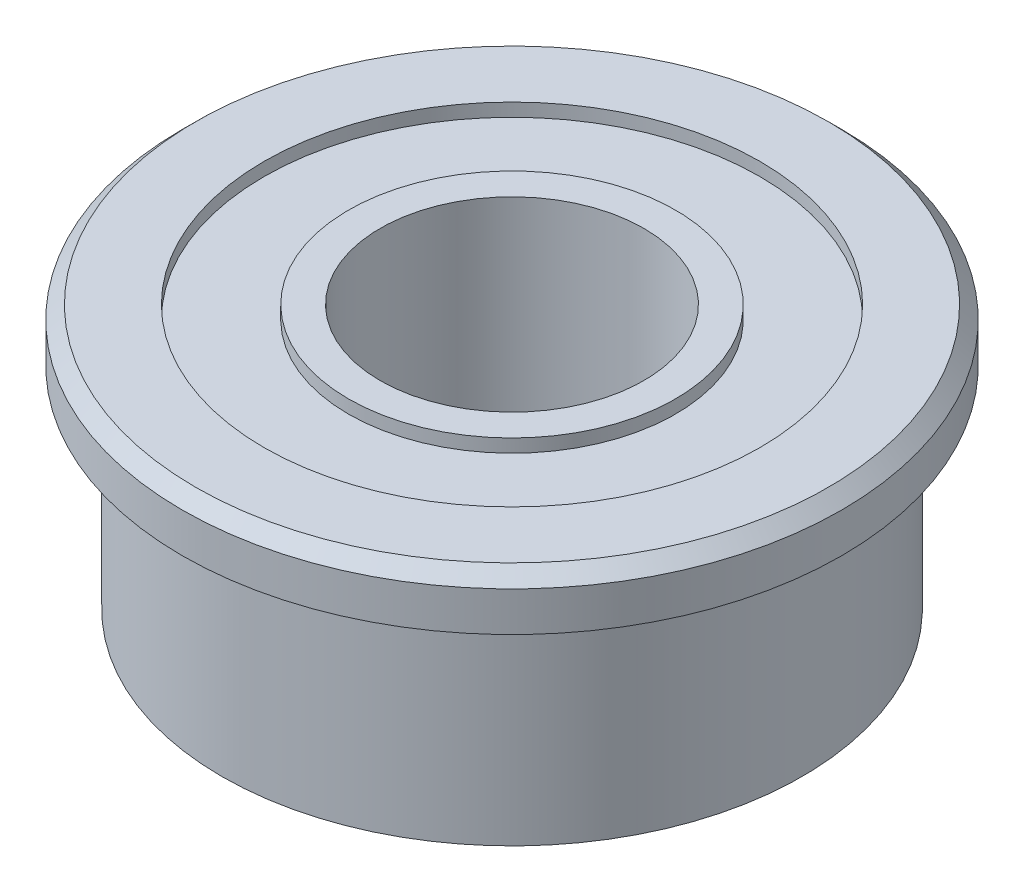
ISO-10303-21;
HEADER;
FILE_DESCRIPTION(('STEP AP214'),'2;1');
FILE_NAME('part.step','',(''),(''),'','','');
FILE_SCHEMA(('AUTOMOTIVE_DESIGN { 1 0 10303 214 1 1 1 1 }'));
ENDSEC;
DATA;
#1=APPLICATION_CONTEXT('core data for automotive mechanical design processes');
#2=APPLICATION_PROTOCOL_DEFINITION('international standard','automotive_design',2000,#1);
#3=PRODUCT_CONTEXT('',#1,'mechanical');
#4=PRODUCT('Part','Part','',(#3));
#5=PRODUCT_RELATED_PRODUCT_CATEGORY('part','',(#4));
#6=PRODUCT_DEFINITION_FORMATION('','',#4);
#7=PRODUCT_DEFINITION_CONTEXT('part definition',#1,'design');
#8=PRODUCT_DEFINITION('design','',#6,#7);
#9=PRODUCT_DEFINITION_SHAPE('','',#8);
#10=(LENGTH_UNIT() NAMED_UNIT(*) SI_UNIT(.MILLI.,.METRE.));
#11=(NAMED_UNIT(*) PLANE_ANGLE_UNIT() SI_UNIT($,.RADIAN.));
#12=(NAMED_UNIT(*) SI_UNIT($,.STERADIAN.) SOLID_ANGLE_UNIT());
#13=UNCERTAINTY_MEASURE_WITH_UNIT(LENGTH_MEASURE(1.E-05),#10,'distance_accuracy_value','');
#14=(GEOMETRIC_REPRESENTATION_CONTEXT(3) GLOBAL_UNCERTAINTY_ASSIGNED_CONTEXT((#13)) GLOBAL_UNIT_ASSIGNED_CONTEXT((#10,
#11,#12)) REPRESENTATION_CONTEXT('',''));
#15=CARTESIAN_POINT('',(0.,0.,0.));
#16=DIRECTION('',(0.,0.,1.));
#17=DIRECTION('',(1.,0.,0.));
#18=AXIS2_PLACEMENT_3D('',#15,#16,#17);
#19=CARTESIAN_POINT('',(0.,5.,0.));
#20=DIRECTION('',(0.,1.,0.));
#21=DIRECTION('',(0.,0.,1.));
#22=AXIS2_PLACEMENT_3D('',#19,#20,#21);
#23=PLANE('',#22);
#24=CARTESIAN_POINT('',(0.,5.,0.));
#25=DIRECTION('',(0.,1.,0.));
#26=DIRECTION('',(0.,0.,1.));
#27=AXIS2_PLACEMENT_3D('',#24,#25,#26);
#28=CIRCLE('',#27,2.5);
#29=CARTESIAN_POINT('',(0.,5.,2.5));
#30=VERTEX_POINT('',#29);
#31=EDGE_CURVE('E78',#30,#30,#28,.T.);
#32=ORIENTED_EDGE('',*,*,#31,.F.);
#33=EDGE_LOOP('',(#32));
#34=FACE_BOUND('',#33,.T.);
#35=CARTESIAN_POINT('',(0.,5.,0.));
#36=DIRECTION('',(0.,1.,0.));
#37=DIRECTION('',(0.,0.,1.));
#38=AXIS2_PLACEMENT_3D('',#35,#36,#37);
#39=CIRCLE('',#38,3.1);
#40=CARTESIAN_POINT('',(0.,5.,3.1));
#41=VERTEX_POINT('',#40);
#42=EDGE_CURVE('E100',#41,#41,#39,.T.);
#43=ORIENTED_EDGE('',*,*,#42,.T.);
#44=EDGE_LOOP('',(#43));
#45=FACE_BOUND('',#44,.T.);
#46=ADVANCED_FACE('F51',(#34,#45),#23,.T.);
#47=CARTESIAN_POINT('',(0.,0.,0.));
#48=DIRECTION('',(0.,1.,0.));
#49=DIRECTION('',(0.,0.,1.));
#50=AXIS2_PLACEMENT_3D('',#47,#48,#49);
#51=PLANE('',#50);
#52=CARTESIAN_POINT('',(0.,0.,0.));
#53=DIRECTION('',(0.,1.,0.));
#54=DIRECTION('',(0.,0.,1.));
#55=AXIS2_PLACEMENT_3D('',#52,#53,#54);
#56=CIRCLE('',#55,2.5);
#57=CARTESIAN_POINT('',(0.,0.,2.5));
#58=VERTEX_POINT('',#57);
#59=EDGE_CURVE('E71',#58,#58,#56,.T.);
#60=ORIENTED_EDGE('',*,*,#59,.T.);
#61=EDGE_LOOP('',(#60));
#62=FACE_BOUND('',#61,.T.);
#63=CARTESIAN_POINT('',(0.,0.,0.));
#64=DIRECTION('',(0.,-1.,0.));
#65=DIRECTION('',(0.,0.,-1.));
#66=AXIS2_PLACEMENT_3D('',#63,#64,#65);
#67=CIRCLE('',#66,3.1);
#68=CARTESIAN_POINT('',(0.,0.,-3.1));
#69=VERTEX_POINT('',#68);
#70=EDGE_CURVE('E88',#69,#69,#67,.T.);
#71=ORIENTED_EDGE('',*,*,#70,.T.);
#72=EDGE_LOOP('',(#71));
#73=FACE_BOUND('',#72,.T.);
#74=ADVANCED_FACE('F141',(#62,#73),#51,.F.);
#75=CARTESIAN_POINT('',(0.,0.,0.));
#76=DIRECTION('',(0.,-1.,0.));
#77=DIRECTION('',(0.,0.,-1.));
#78=AXIS2_PLACEMENT_3D('',#75,#76,#77);
#79=CIRCLE('',#78,4.7);
#80=CARTESIAN_POINT('',(0.,0.,-4.7));
#81=VERTEX_POINT('',#80);
#82=EDGE_CURVE('E82',#81,#81,#79,.T.);
#83=ORIENTED_EDGE('',*,*,#82,.F.);
#84=EDGE_LOOP('',(#83));
#85=FACE_BOUND('',#84,.T.);
#86=CARTESIAN_POINT('',(0.,0.,0.));
#87=DIRECTION('',(0.,1.,0.));
#88=DIRECTION('',(0.,0.,1.));
#89=AXIS2_PLACEMENT_3D('',#86,#87,#88);
#90=CIRCLE('',#89,5.5);
#91=CARTESIAN_POINT('',(0.,0.,5.5));
#92=VERTEX_POINT('',#91);
#93=EDGE_CURVE('E67',#92,#92,#90,.T.);
#94=ORIENTED_EDGE('',*,*,#93,.F.);
#95=EDGE_LOOP('',(#94));
#96=FACE_BOUND('',#95,.T.);
#97=ADVANCED_FACE('F147',(#85,#96),#51,.F.);
#98=CARTESIAN_POINT('',(0.,4.,0.));
#99=DIRECTION('',(0.,-1.,0.));
#100=DIRECTION('',(0.,0.,-1.));
#101=AXIS2_PLACEMENT_3D('',#98,#99,#100);
#102=CYLINDRICAL_SURFACE('',#101,5.5);
#103=CARTESIAN_POINT('',(0.,4.,0.));
#104=DIRECTION('',(0.,1.,0.));
#105=DIRECTION('',(0.,0.,1.));
#106=AXIS2_PLACEMENT_3D('',#103,#104,#105);
#107=CIRCLE('',#106,5.5);
#108=CARTESIAN_POINT('',(0.,4.,5.5));
#109=VERTEX_POINT('',#108);
#110=EDGE_CURVE('E63',#109,#109,#107,.T.);
#111=ORIENTED_EDGE('',*,*,#110,.F.);
#112=EDGE_LOOP('',(#111));
#113=FACE_BOUND('',#112,.T.);
#114=ORIENTED_EDGE('',*,*,#93,.T.);
#115=EDGE_LOOP('',(#114));
#116=FACE_BOUND('',#115,.T.);
#117=ADVANCED_FACE('F136',(#113,#116),#102,.T.);
#118=CARTESIAN_POINT('',(0.,4.,0.));
#119=DIRECTION('',(0.,-1.,0.));
#120=DIRECTION('',(0.,0.,-1.));
#121=AXIS2_PLACEMENT_3D('',#118,#119,#120);
#122=CYLINDRICAL_SURFACE('',#121,2.5);
#123=ORIENTED_EDGE('',*,*,#59,.F.);
#124=EDGE_LOOP('',(#123));
#125=FACE_BOUND('',#124,.T.);
#126=ORIENTED_EDGE('',*,*,#31,.T.);
#127=EDGE_LOOP('',(#126));
#128=FACE_BOUND('',#127,.T.);
#129=ADVANCED_FACE('F125',(#125,#128),#122,.F.);
#130=CARTESIAN_POINT('',(0.,5.,0.));
#131=DIRECTION('',(0.,1.,0.));
#132=DIRECTION('',(0.,0.,1.));
#133=AXIS2_PLACEMENT_3D('',#130,#131,#132);
#134=CIRCLE('',#133,6.);
#135=CARTESIAN_POINT('',(0.,5.,6.));
#136=VERTEX_POINT('',#135);
#137=EDGE_CURVE('E59',#136,#136,#134,.T.);
#138=ORIENTED_EDGE('',*,*,#137,.T.);
#139=EDGE_LOOP('',(#138));
#140=FACE_BOUND('',#139,.T.);
#141=CARTESIAN_POINT('',(0.,5.,0.));
#142=DIRECTION('',(0.,1.,0.));
#143=DIRECTION('',(0.,0.,1.));
#144=AXIS2_PLACEMENT_3D('',#141,#142,#143);
#145=CIRCLE('',#144,4.7);
#146=CARTESIAN_POINT('',(0.,5.,4.7));
#147=VERTEX_POINT('',#146);
#148=EDGE_CURVE('E94',#147,#147,#145,.T.);
#149=ORIENTED_EDGE('',*,*,#148,.F.);
#150=EDGE_LOOP('',(#149));
#151=FACE_BOUND('',#150,.T.);
#152=ADVANCED_FACE('F122',(#140,#151),#23,.T.);
#153=CARTESIAN_POINT('',(0.,4.,0.));
#154=DIRECTION('',(0.,1.,0.));
#155=DIRECTION('',(0.,0.,1.));
#156=AXIS2_PLACEMENT_3D('',#153,#154,#155);
#157=PLANE('',#156);
#158=ORIENTED_EDGE('',*,*,#110,.T.);
#159=EDGE_LOOP('',(#158));
#160=FACE_BOUND('',#159,.T.);
#161=CARTESIAN_POINT('',(0.,4.,0.));
#162=DIRECTION('',(0.,1.,0.));
#163=DIRECTION('',(0.,0.,1.));
#164=AXIS2_PLACEMENT_3D('',#161,#162,#163);
#165=CIRCLE('',#164,6.25);
#166=CARTESIAN_POINT('',(0.,4.,6.25));
#167=VERTEX_POINT('',#166);
#168=EDGE_CURVE('E75',#167,#167,#165,.T.);
#169=ORIENTED_EDGE('',*,*,#168,.F.);
#170=EDGE_LOOP('',(#169));
#171=FACE_BOUND('',#170,.T.);
#172=ADVANCED_FACE('F124',(#160,#171),#157,.F.);
#173=CARTESIAN_POINT('',(0.,5.,0.));
#174=DIRECTION('',(0.,-1.,0.));
#175=DIRECTION('',(0.,0.,-1.));
#176=AXIS2_PLACEMENT_3D('',#173,#174,#175);
#177=CYLINDRICAL_SURFACE('',#176,6.25);
#178=CARTESIAN_POINT('',(0.,4.75,0.));
#179=DIRECTION('',(0.,1.,0.));
#180=DIRECTION('',(0.,0.,1.));
#181=AXIS2_PLACEMENT_3D('',#178,#179,#180);
#182=CIRCLE('',#181,6.25);
#183=CARTESIAN_POINT('',(0.,4.75,6.25));
#184=VERTEX_POINT('',#183);
#185=EDGE_CURVE('E10',#184,#184,#182,.F.);
#186=ORIENTED_EDGE('',*,*,#185,.T.);
#187=EDGE_LOOP('',(#186));
#188=FACE_BOUND('',#187,.T.);
#189=ORIENTED_EDGE('',*,*,#168,.T.);
#190=EDGE_LOOP('',(#189));
#191=FACE_BOUND('',#190,.T.);
#192=ADVANCED_FACE('F132',(#188,#191),#177,.T.);
#193=CARTESIAN_POINT('',(0.,0.25,0.));
#194=DIRECTION('',(0.,-1.,0.));
#195=DIRECTION('',(0.,0.,-1.));
#196=AXIS2_PLACEMENT_3D('',#193,#194,#195);
#197=CYLINDRICAL_SURFACE('',#196,4.7);
#198=CARTESIAN_POINT('',(0.,0.25,0.));
#199=DIRECTION('',(0.,-1.,0.));
#200=DIRECTION('',(0.,0.,-1.));
#201=AXIS2_PLACEMENT_3D('',#198,#199,#200);
#202=CIRCLE('',#201,4.7);
#203=CARTESIAN_POINT('',(0.,0.25,-4.7));
#204=VERTEX_POINT('',#203);
#205=EDGE_CURVE('E81',#204,#204,#202,.T.);
#206=ORIENTED_EDGE('',*,*,#205,.F.);
#207=EDGE_LOOP('',(#206));
#208=FACE_BOUND('',#207,.T.);
#209=ORIENTED_EDGE('',*,*,#82,.T.);
#210=EDGE_LOOP('',(#209));
#211=FACE_BOUND('',#210,.T.);
#212=ADVANCED_FACE('F164',(#208,#211),#197,.F.);
#213=CARTESIAN_POINT('',(0.,0.25,0.));
#214=DIRECTION('',(0.,-1.,0.));
#215=DIRECTION('',(0.,0.,-1.));
#216=AXIS2_PLACEMENT_3D('',#213,#214,#215);
#217=PLANE('',#216);
#218=CARTESIAN_POINT('',(0.,0.25,0.));
#219=DIRECTION('',(0.,-1.,0.));
#220=DIRECTION('',(0.,0.,-1.));
#221=AXIS2_PLACEMENT_3D('',#218,#219,#220);
#222=CIRCLE('',#221,3.1);
#223=CARTESIAN_POINT('',(0.,0.25,-3.1));
#224=VERTEX_POINT('',#223);
#225=EDGE_CURVE('E85',#224,#224,#222,.T.);
#226=ORIENTED_EDGE('',*,*,#225,.F.);
#227=EDGE_LOOP('',(#226));
#228=FACE_BOUND('',#227,.T.);
#229=ORIENTED_EDGE('',*,*,#205,.T.);
#230=EDGE_LOOP('',(#229));
#231=FACE_BOUND('',#230,.T.);
#232=ADVANCED_FACE('F161',(#228,#231),#217,.T.);
#233=CARTESIAN_POINT('',(0.,0.25,0.));
#234=DIRECTION('',(0.,-1.,0.));
#235=DIRECTION('',(0.,0.,-1.));
#236=AXIS2_PLACEMENT_3D('',#233,#234,#235);
#237=CYLINDRICAL_SURFACE('',#236,3.1);
#238=ORIENTED_EDGE('',*,*,#225,.T.);
#239=EDGE_LOOP('',(#238));
#240=FACE_BOUND('',#239,.T.);
#241=ORIENTED_EDGE('',*,*,#70,.F.);
#242=EDGE_LOOP('',(#241));
#243=FACE_BOUND('',#242,.T.);
#244=ADVANCED_FACE('F118',(#240,#243),#237,.T.);
#245=CARTESIAN_POINT('',(0.,4.75,0.));
#246=DIRECTION('',(0.,1.,0.));
#247=DIRECTION('',(0.,0.,1.));
#248=AXIS2_PLACEMENT_3D('',#245,#246,#247);
#249=CYLINDRICAL_SURFACE('',#248,4.7);
#250=CARTESIAN_POINT('',(0.,4.75,0.));
#251=DIRECTION('',(0.,1.,0.));
#252=DIRECTION('',(0.,0.,1.));
#253=AXIS2_PLACEMENT_3D('',#250,#251,#252);
#254=CIRCLE('',#253,4.7);
#255=CARTESIAN_POINT('',(0.,4.75,4.7));
#256=VERTEX_POINT('',#255);
#257=EDGE_CURVE('E91',#256,#256,#254,.T.);
#258=ORIENTED_EDGE('',*,*,#257,.F.);
#259=EDGE_LOOP('',(#258));
#260=FACE_BOUND('',#259,.T.);
#261=ORIENTED_EDGE('',*,*,#148,.T.);
#262=EDGE_LOOP('',(#261));
#263=FACE_BOUND('',#262,.T.);
#264=ADVANCED_FACE('F112',(#260,#263),#249,.F.);
#265=CARTESIAN_POINT('',(0.,4.75,0.));
#266=DIRECTION('',(0.,1.,0.));
#267=DIRECTION('',(0.,0.,1.));
#268=AXIS2_PLACEMENT_3D('',#265,#266,#267);
#269=PLANE('',#268);
#270=CARTESIAN_POINT('',(0.,4.75,0.));
#271=DIRECTION('',(0.,1.,0.));
#272=DIRECTION('',(0.,0.,1.));
#273=AXIS2_PLACEMENT_3D('',#270,#271,#272);
#274=CIRCLE('',#273,3.1);
#275=CARTESIAN_POINT('',(0.,4.75,3.1));
#276=VERTEX_POINT('',#275);
#277=EDGE_CURVE('E97',#276,#276,#274,.T.);
#278=ORIENTED_EDGE('',*,*,#277,.F.);
#279=EDGE_LOOP('',(#278));
#280=FACE_BOUND('',#279,.T.);
#281=ORIENTED_EDGE('',*,*,#257,.T.);
#282=EDGE_LOOP('',(#281));
#283=FACE_BOUND('',#282,.T.);
#284=ADVANCED_FACE('F109',(#280,#283),#269,.T.);
#285=CARTESIAN_POINT('',(0.,4.75,0.));
#286=DIRECTION('',(0.,1.,0.));
#287=DIRECTION('',(0.,0.,1.));
#288=AXIS2_PLACEMENT_3D('',#285,#286,#287);
#289=CYLINDRICAL_SURFACE('',#288,3.1);
#290=ORIENTED_EDGE('',*,*,#277,.T.);
#291=EDGE_LOOP('',(#290));
#292=FACE_BOUND('',#291,.T.);
#293=ORIENTED_EDGE('',*,*,#42,.F.);
#294=EDGE_LOOP('',(#293));
#295=FACE_BOUND('',#294,.T.);
#296=ADVANCED_FACE('F106',(#292,#295),#289,.T.);
#297=CARTESIAN_POINT('',(0.,5.,0.));
#298=DIRECTION('',(0.,-1.,0.));
#299=DIRECTION('',(0.,0.,-1.));
#300=AXIS2_PLACEMENT_3D('',#297,#298,#299);
#301=CONICAL_SURFACE('',#300,6.,0.785398163397443);
#302=ORIENTED_EDGE('',*,*,#185,.F.);
#303=EDGE_LOOP('',(#302));
#304=FACE_BOUND('',#303,.T.);
#305=ORIENTED_EDGE('',*,*,#137,.F.);
#306=EDGE_LOOP('',(#305));
#307=FACE_BOUND('',#306,.T.);
#308=ADVANCED_FACE('F54',(#304,#307),#301,.T.);
#309=CLOSED_SHELL('',(#46,#74,#97,#117,#129,#152,#172,#192,#212,#232,#244,#264,#284,#296,#308));
#310=MANIFOLD_SOLID_BREP('B2',#309);
#311=ADVANCED_BREP_SHAPE_REPRESENTATION('',(#18,#310),#14);
#312=SHAPE_DEFINITION_REPRESENTATION(#9,#311);
ENDSEC;
END-ISO-10303-21;
